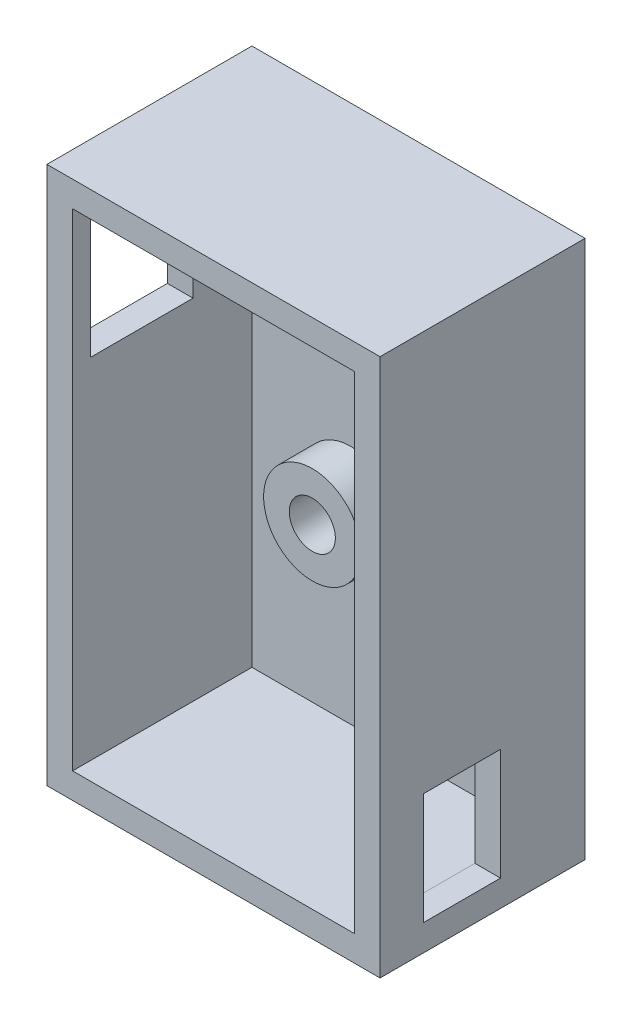
ISO-10303-21;
HEADER;
FILE_DESCRIPTION(('STEP AP214'),'2;1');
FILE_NAME('part.step','',(''),(''),'','','');
FILE_SCHEMA(('AUTOMOTIVE_DESIGN { 1 0 10303 214 1 1 1 1 }'));
ENDSEC;
DATA;
#1=APPLICATION_CONTEXT('core data for automotive mechanical design processes');
#2=APPLICATION_PROTOCOL_DEFINITION('international standard','automotive_design',2000,#1);
#3=PRODUCT_CONTEXT('',#1,'mechanical');
#4=PRODUCT('Part','Part','',(#3));
#5=PRODUCT_RELATED_PRODUCT_CATEGORY('part','',(#4));
#6=PRODUCT_DEFINITION_FORMATION('','',#4);
#7=PRODUCT_DEFINITION_CONTEXT('part definition',#1,'design');
#8=PRODUCT_DEFINITION('design','',#6,#7);
#9=PRODUCT_DEFINITION_SHAPE('','',#8);
#10=(LENGTH_UNIT() NAMED_UNIT(*) SI_UNIT(.MILLI.,.METRE.));
#11=(NAMED_UNIT(*) PLANE_ANGLE_UNIT() SI_UNIT($,.RADIAN.));
#12=(NAMED_UNIT(*) SI_UNIT($,.STERADIAN.) SOLID_ANGLE_UNIT());
#13=UNCERTAINTY_MEASURE_WITH_UNIT(LENGTH_MEASURE(1.E-05),#10,'distance_accuracy_value','');
#14=(GEOMETRIC_REPRESENTATION_CONTEXT(3) GLOBAL_UNCERTAINTY_ASSIGNED_CONTEXT((#13)) GLOBAL_UNIT_ASSIGNED_CONTEXT((#10,
#11,#12)) REPRESENTATION_CONTEXT('',''));
#15=CARTESIAN_POINT('',(0.,0.,0.));
#16=DIRECTION('',(0.,0.,1.));
#17=DIRECTION('',(1.,0.,0.));
#18=AXIS2_PLACEMENT_3D('',#15,#16,#17);
#19=CARTESIAN_POINT('',(-13.,-21.,16.));
#20=DIRECTION('',(1.,0.,0.));
#21=DIRECTION('',(0.,0.,-1.));
#22=AXIS2_PLACEMENT_3D('',#19,#20,#21);
#23=PLANE('',#22);
#24=DIRECTION('',(0.,-1.,0.));
#25=VECTOR('',#24,1.);
#26=CARTESIAN_POINT('',(-13.,18.9788433783349,6.6));
#27=LINE('',#26,#25);
#28=CARTESIAN_POINT('',(-13.,18.9788433783349,6.6));
#29=VERTEX_POINT('',#28);
#30=CARTESIAN_POINT('',(-13.,8.25334823970601,6.6));
#31=VERTEX_POINT('',#30);
#32=EDGE_CURVE('E207',#29,#31,#27,.T.);
#33=ORIENTED_EDGE('',*,*,#32,.F.);
#34=DIRECTION('',(0.,0.,-1.));
#35=VECTOR('',#34,1.);
#36=CARTESIAN_POINT('',(-13.,18.9788433783349,14.6));
#37=LINE('',#36,#35);
#38=CARTESIAN_POINT('',(-13.,18.9788433783349,14.6));
#39=VERTEX_POINT('',#38);
#40=EDGE_CURVE('E211',#39,#29,#37,.T.);
#41=ORIENTED_EDGE('',*,*,#40,.F.);
#42=DIRECTION('',(0.,1.,0.));
#43=VECTOR('',#42,1.);
#44=CARTESIAN_POINT('',(-13.,18.9788433783349,14.6));
#45=LINE('',#44,#43);
#46=CARTESIAN_POINT('',(-13.,8.25334823970601,14.6));
#47=VERTEX_POINT('',#46);
#48=EDGE_CURVE('E202',#47,#39,#45,.T.);
#49=ORIENTED_EDGE('',*,*,#48,.F.);
#50=DIRECTION('',(0.,0.,1.));
#51=VECTOR('',#50,1.);
#52=CARTESIAN_POINT('',(-13.,8.253348239706,14.6));
#53=LINE('',#52,#51);
#54=EDGE_CURVE('E203',#31,#47,#53,.T.);
#55=ORIENTED_EDGE('',*,*,#54,.F.);
#56=EDGE_LOOP('',(#33,#41,#49,#55));
#57=FACE_BOUND('',#56,.T.);
#58=DIRECTION('',(0.,-1.,0.));
#59=VECTOR('',#58,1.);
#60=CARTESIAN_POINT('',(-13.,-21.,0.));
#61=LINE('',#60,#59);
#62=CARTESIAN_POINT('',(-13.,21.,0.));
#63=VERTEX_POINT('',#62);
#64=CARTESIAN_POINT('',(-13.,-21.,0.));
#65=VERTEX_POINT('',#64);
#66=EDGE_CURVE('E287',#63,#65,#61,.T.);
#67=ORIENTED_EDGE('',*,*,#66,.T.);
#68=DIRECTION('',(0.,0.,-1.));
#69=VECTOR('',#68,1.);
#70=CARTESIAN_POINT('',(-13.,-21.,16.));
#71=LINE('',#70,#69);
#72=CARTESIAN_POINT('',(-13.,-21.,16.));
#73=VERTEX_POINT('',#72);
#74=EDGE_CURVE('E11',#73,#65,#71,.T.);
#75=ORIENTED_EDGE('',*,*,#74,.F.);
#76=DIRECTION('',(0.,-1.,0.));
#77=VECTOR('',#76,1.);
#78=CARTESIAN_POINT('',(-13.,-21.,16.));
#79=LINE('',#78,#77);
#80=CARTESIAN_POINT('',(-13.,21.,16.));
#81=VERTEX_POINT('',#80);
#82=EDGE_CURVE('E321',#81,#73,#79,.T.);
#83=ORIENTED_EDGE('',*,*,#82,.F.);
#84=DIRECTION('',(0.,0.,-1.));
#85=VECTOR('',#84,1.);
#86=CARTESIAN_POINT('',(-13.,21.,16.));
#87=LINE('',#86,#85);
#88=EDGE_CURVE('E335',#81,#63,#87,.T.);
#89=ORIENTED_EDGE('',*,*,#88,.T.);
#90=EDGE_LOOP('',(#67,#75,#83,#89));
#91=FACE_BOUND('',#90,.T.);
#92=ADVANCED_FACE('F43',(#57,#91),#23,.F.);
#93=CARTESIAN_POINT('',(13.,-21.,16.));
#94=DIRECTION('',(0.,1.,0.));
#95=DIRECTION('',(0.,0.,1.));
#96=AXIS2_PLACEMENT_3D('',#93,#94,#95);
#97=PLANE('',#96);
#98=DIRECTION('',(1.,0.,0.));
#99=VECTOR('',#98,1.);
#100=CARTESIAN_POINT('',(13.,-21.,0.));
#101=LINE('',#100,#99);
#102=CARTESIAN_POINT('',(13.,-21.,0.));
#103=VERTEX_POINT('',#102);
#104=EDGE_CURVE('E339',#65,#103,#101,.T.);
#105=ORIENTED_EDGE('',*,*,#104,.T.);
#106=DIRECTION('',(0.,0.,-1.));
#107=VECTOR('',#106,1.);
#108=CARTESIAN_POINT('',(13.,-21.,16.));
#109=LINE('',#108,#107);
#110=CARTESIAN_POINT('',(13.,-21.,16.));
#111=VERTEX_POINT('',#110);
#112=EDGE_CURVE('E51',#111,#103,#109,.T.);
#113=ORIENTED_EDGE('',*,*,#112,.F.);
#114=DIRECTION('',(1.,0.,0.));
#115=VECTOR('',#114,1.);
#116=CARTESIAN_POINT('',(13.,-21.,16.));
#117=LINE('',#116,#115);
#118=EDGE_CURVE('E325',#73,#111,#117,.T.);
#119=ORIENTED_EDGE('',*,*,#118,.F.);
#120=ORIENTED_EDGE('',*,*,#74,.T.);
#121=EDGE_LOOP('',(#105,#113,#119,#120));
#122=FACE_BOUND('',#121,.T.);
#123=ADVANCED_FACE('F375',(#122),#97,.F.);
#124=CARTESIAN_POINT('',(13.,-21.,16.));
#125=DIRECTION('',(-1.,0.,0.));
#126=DIRECTION('',(0.,-1.,0.));
#127=AXIS2_PLACEMENT_3D('',#124,#125,#126);
#128=PLANE('',#127);
#129=DIRECTION('',(0.,1.,0.));
#130=VECTOR('',#129,1.);
#131=CARTESIAN_POINT('',(13.,-10.2396995631783,6.6));
#132=LINE('',#131,#130);
#133=CARTESIAN_POINT('',(13.,-18.9486797720377,6.6));
#134=VERTEX_POINT('',#133);
#135=CARTESIAN_POINT('',(13.,-10.2396995631783,6.6));
#136=VERTEX_POINT('',#135);
#137=EDGE_CURVE('E184',#134,#136,#132,.T.);
#138=ORIENTED_EDGE('',*,*,#137,.F.);
#139=DIRECTION('',(0.,0.,-1.));
#140=VECTOR('',#139,1.);
#141=CARTESIAN_POINT('',(13.,-18.9486797720377,12.6));
#142=LINE('',#141,#140);
#143=CARTESIAN_POINT('',(13.,-18.9486797720377,12.6));
#144=VERTEX_POINT('',#143);
#145=EDGE_CURVE('E174',#144,#134,#142,.T.);
#146=ORIENTED_EDGE('',*,*,#145,.F.);
#147=DIRECTION('',(0.,-1.,0.));
#148=VECTOR('',#147,1.);
#149=CARTESIAN_POINT('',(13.,-10.2396995631783,12.6));
#150=LINE('',#149,#148);
#151=CARTESIAN_POINT('',(13.,-10.2396995631783,12.6));
#152=VERTEX_POINT('',#151);
#153=EDGE_CURVE('E188',#152,#144,#150,.T.);
#154=ORIENTED_EDGE('',*,*,#153,.F.);
#155=DIRECTION('',(0.,0.,1.));
#156=VECTOR('',#155,1.);
#157=CARTESIAN_POINT('',(13.,-10.2396995631783,12.6));
#158=LINE('',#157,#156);
#159=EDGE_CURVE('E58',#136,#152,#158,.T.);
#160=ORIENTED_EDGE('',*,*,#159,.F.);
#161=EDGE_LOOP('',(#138,#146,#154,#160));
#162=FACE_BOUND('',#161,.T.);
#163=DIRECTION('',(0.,1.,0.));
#164=VECTOR('',#163,1.);
#165=CARTESIAN_POINT('',(13.,-21.,0.));
#166=LINE('',#165,#164);
#167=CARTESIAN_POINT('',(13.,21.,0.));
#168=VERTEX_POINT('',#167);
#169=EDGE_CURVE('E342',#103,#168,#166,.T.);
#170=ORIENTED_EDGE('',*,*,#169,.T.);
#171=DIRECTION('',(0.,0.,-1.));
#172=VECTOR('',#171,1.);
#173=CARTESIAN_POINT('',(13.,21.,16.));
#174=LINE('',#173,#172);
#175=CARTESIAN_POINT('',(13.,21.,16.));
#176=VERTEX_POINT('',#175);
#177=EDGE_CURVE('E350',#176,#168,#174,.T.);
#178=ORIENTED_EDGE('',*,*,#177,.F.);
#179=DIRECTION('',(0.,1.,0.));
#180=VECTOR('',#179,1.);
#181=CARTESIAN_POINT('',(13.,-21.,16.));
#182=LINE('',#181,#180);
#183=EDGE_CURVE('E329',#111,#176,#182,.T.);
#184=ORIENTED_EDGE('',*,*,#183,.F.);
#185=ORIENTED_EDGE('',*,*,#112,.T.);
#186=EDGE_LOOP('',(#170,#178,#184,#185));
#187=FACE_BOUND('',#186,.T.);
#188=ADVANCED_FACE('F359',(#162,#187),#128,.F.);
#189=CARTESIAN_POINT('',(13.,21.,16.));
#190=DIRECTION('',(0.,-1.,0.));
#191=DIRECTION('',(1.,0.,0.));
#192=AXIS2_PLACEMENT_3D('',#189,#190,#191);
#193=PLANE('',#192);
#194=DIRECTION('',(-1.,0.,0.));
#195=VECTOR('',#194,1.);
#196=CARTESIAN_POINT('',(13.,21.,0.));
#197=LINE('',#196,#195);
#198=EDGE_CURVE('E326',#168,#63,#197,.T.);
#199=ORIENTED_EDGE('',*,*,#198,.T.);
#200=ORIENTED_EDGE('',*,*,#88,.F.);
#201=DIRECTION('',(-1.,0.,0.));
#202=VECTOR('',#201,1.);
#203=CARTESIAN_POINT('',(13.,21.,16.));
#204=LINE('',#203,#202);
#205=EDGE_CURVE('E332',#176,#81,#204,.T.);
#206=ORIENTED_EDGE('',*,*,#205,.F.);
#207=ORIENTED_EDGE('',*,*,#177,.T.);
#208=EDGE_LOOP('',(#199,#200,#206,#207));
#209=FACE_BOUND('',#208,.T.);
#210=ADVANCED_FACE('F368',(#209),#193,.F.);
#211=CARTESIAN_POINT('',(0.,0.,16.));
#212=DIRECTION('',(0.,0.,1.));
#213=DIRECTION('',(1.,0.,0.));
#214=AXIS2_PLACEMENT_3D('',#211,#212,#213);
#215=PLANE('',#214);
#216=DIRECTION('',(0.,-1.,0.));
#217=VECTOR('',#216,1.);
#218=CARTESIAN_POINT('',(-11.,-21.,16.));
#219=LINE('',#218,#217);
#220=CARTESIAN_POINT('',(-11.,19.,16.));
#221=VERTEX_POINT('',#220);
#222=CARTESIAN_POINT('',(-11.,-19.,16.));
#223=VERTEX_POINT('',#222);
#224=EDGE_CURVE('E309',#221,#223,#219,.T.);
#225=ORIENTED_EDGE('',*,*,#224,.F.);
#226=DIRECTION('',(-1.,0.,0.));
#227=VECTOR('',#226,1.);
#228=CARTESIAN_POINT('',(13.,19.,16.));
#229=LINE('',#228,#227);
#230=CARTESIAN_POINT('',(11.,19.,16.));
#231=VERTEX_POINT('',#230);
#232=EDGE_CURVE('E294',#231,#221,#229,.T.);
#233=ORIENTED_EDGE('',*,*,#232,.F.);
#234=DIRECTION('',(0.,1.,0.));
#235=VECTOR('',#234,1.);
#236=CARTESIAN_POINT('',(11.,-21.,16.));
#237=LINE('',#236,#235);
#238=CARTESIAN_POINT('',(11.,-19.,16.));
#239=VERTEX_POINT('',#238);
#240=EDGE_CURVE('E315',#239,#231,#237,.T.);
#241=ORIENTED_EDGE('',*,*,#240,.F.);
#242=DIRECTION('',(1.,0.,0.));
#243=VECTOR('',#242,1.);
#244=CARTESIAN_POINT('',(13.,-19.,16.));
#245=LINE('',#244,#243);
#246=EDGE_CURVE('E312',#223,#239,#245,.T.);
#247=ORIENTED_EDGE('',*,*,#246,.F.);
#248=EDGE_LOOP('',(#225,#233,#241,#247));
#249=FACE_BOUND('',#248,.T.);
#250=ORIENTED_EDGE('',*,*,#82,.T.);
#251=ORIENTED_EDGE('',*,*,#118,.T.);
#252=ORIENTED_EDGE('',*,*,#183,.T.);
#253=ORIENTED_EDGE('',*,*,#205,.T.);
#254=EDGE_LOOP('',(#250,#251,#252,#253));
#255=FACE_BOUND('',#254,.T.);
#256=ADVANCED_FACE('F374',(#249,#255),#215,.T.);
#257=CARTESIAN_POINT('',(0.,0.,0.));
#258=DIRECTION('',(0.,0.,1.));
#259=DIRECTION('',(1.,0.,0.));
#260=AXIS2_PLACEMENT_3D('',#257,#258,#259);
#261=PLANE('',#260);
#262=CARTESIAN_POINT('',(6.486240627427,13.7353561134825,0.));
#263=DIRECTION('',(0.,0.,1.));
#264=DIRECTION('',(1.,0.,0.));
#265=AXIS2_PLACEMENT_3D('',#262,#263,#264);
#266=CIRCLE('',#265,1.8);
#267=CARTESIAN_POINT('',(8.286240627427,13.7353561134825,0.));
#268=VERTEX_POINT('',#267);
#269=EDGE_CURVE('E247',#268,#268,#266,.F.);
#270=ORIENTED_EDGE('',*,*,#269,.F.);
#271=EDGE_LOOP('',(#270));
#272=FACE_BOUND('',#271,.T.);
#273=CARTESIAN_POINT('',(-3.28816906454668,-4.00641873558866,0.));
#274=DIRECTION('',(0.,0.,1.));
#275=DIRECTION('',(1.,0.,0.));
#276=AXIS2_PLACEMENT_3D('',#273,#274,#275);
#277=CIRCLE('',#276,1.8);
#278=CARTESIAN_POINT('',(-1.48816906454668,-4.00641873558866,0.));
#279=VERTEX_POINT('',#278);
#280=EDGE_CURVE('E246',#279,#279,#277,.F.);
#281=ORIENTED_EDGE('',*,*,#280,.F.);
#282=EDGE_LOOP('',(#281));
#283=FACE_BOUND('',#282,.T.);
#284=ORIENTED_EDGE('',*,*,#66,.F.);
#285=ORIENTED_EDGE('',*,*,#198,.F.);
#286=ORIENTED_EDGE('',*,*,#169,.F.);
#287=ORIENTED_EDGE('',*,*,#104,.F.);
#288=EDGE_LOOP('',(#284,#285,#286,#287));
#289=FACE_BOUND('',#288,.T.);
#290=ADVANCED_FACE('F365',(#272,#283,#289),#261,.F.);
#291=CARTESIAN_POINT('',(-11.,-21.,16.));
#292=DIRECTION('',(1.,0.,0.));
#293=DIRECTION('',(0.,0.,-1.));
#294=AXIS2_PLACEMENT_3D('',#291,#292,#293);
#295=PLANE('',#294);
#296=DIRECTION('',(0.,0.,-1.));
#297=VECTOR('',#296,1.);
#298=CARTESIAN_POINT('',(-11.,18.9788433783349,14.6));
#299=LINE('',#298,#297);
#300=CARTESIAN_POINT('',(-11.,18.9788433783349,14.6));
#301=VERTEX_POINT('',#300);
#302=CARTESIAN_POINT('',(-11.,18.9788433783349,6.6));
#303=VERTEX_POINT('',#302);
#304=EDGE_CURVE('E206',#301,#303,#299,.T.);
#305=ORIENTED_EDGE('',*,*,#304,.T.);
#306=DIRECTION('',(0.,-1.,0.));
#307=VECTOR('',#306,1.);
#308=CARTESIAN_POINT('',(-11.,18.9788433783349,6.6));
#309=LINE('',#308,#307);
#310=CARTESIAN_POINT('',(-11.,8.25334823970601,6.6));
#311=VERTEX_POINT('',#310);
#312=EDGE_CURVE('E233',#303,#311,#309,.T.);
#313=ORIENTED_EDGE('',*,*,#312,.T.);
#314=DIRECTION('',(0.,0.,1.));
#315=VECTOR('',#314,1.);
#316=CARTESIAN_POINT('',(-11.,8.253348239706,14.6));
#317=LINE('',#316,#315);
#318=CARTESIAN_POINT('',(-11.,8.253348239706,14.6));
#319=VERTEX_POINT('',#318);
#320=EDGE_CURVE('E228',#311,#319,#317,.T.);
#321=ORIENTED_EDGE('',*,*,#320,.T.);
#322=DIRECTION('',(0.,1.,0.));
#323=VECTOR('',#322,1.);
#324=CARTESIAN_POINT('',(-11.,18.9788433783349,14.6));
#325=LINE('',#324,#323);
#326=EDGE_CURVE('E222',#319,#301,#325,.T.);
#327=ORIENTED_EDGE('',*,*,#326,.T.);
#328=EDGE_LOOP('',(#305,#313,#321,#327));
#329=FACE_BOUND('',#328,.T.);
#330=DIRECTION('',(0.,-1.,0.));
#331=VECTOR('',#330,1.);
#332=CARTESIAN_POINT('',(-11.,-21.,2.));
#333=LINE('',#332,#331);
#334=CARTESIAN_POINT('',(-11.,19.,2.));
#335=VERTEX_POINT('',#334);
#336=CARTESIAN_POINT('',(-11.,-19.,2.));
#337=VERTEX_POINT('',#336);
#338=EDGE_CURVE('E275',#335,#337,#333,.T.);
#339=ORIENTED_EDGE('',*,*,#338,.F.);
#340=DIRECTION('',(0.,0.,-1.));
#341=VECTOR('',#340,1.);
#342=CARTESIAN_POINT('',(-11.,19.,16.));
#343=LINE('',#342,#341);
#344=EDGE_CURVE('E289',#221,#335,#343,.T.);
#345=ORIENTED_EDGE('',*,*,#344,.F.);
#346=ORIENTED_EDGE('',*,*,#224,.T.);
#347=DIRECTION('',(0.,0.,-1.));
#348=VECTOR('',#347,1.);
#349=CARTESIAN_POINT('',(-11.,-19.,16.));
#350=LINE('',#349,#348);
#351=EDGE_CURVE('E283',#223,#337,#350,.T.);
#352=ORIENTED_EDGE('',*,*,#351,.T.);
#353=EDGE_LOOP('',(#339,#345,#346,#352));
#354=FACE_BOUND('',#353,.T.);
#355=ADVANCED_FACE('F389',(#329,#354),#295,.T.);
#356=CARTESIAN_POINT('',(13.,-19.,16.));
#357=DIRECTION('',(0.,1.,0.));
#358=DIRECTION('',(0.,0.,1.));
#359=AXIS2_PLACEMENT_3D('',#356,#357,#358);
#360=PLANE('',#359);
#361=DIRECTION('',(1.,0.,0.));
#362=VECTOR('',#361,1.);
#363=CARTESIAN_POINT('',(13.,-19.,2.));
#364=LINE('',#363,#362);
#365=CARTESIAN_POINT('',(11.,-19.,2.));
#366=VERTEX_POINT('',#365);
#367=EDGE_CURVE('E282',#337,#366,#364,.T.);
#368=ORIENTED_EDGE('',*,*,#367,.F.);
#369=ORIENTED_EDGE('',*,*,#351,.F.);
#370=ORIENTED_EDGE('',*,*,#246,.T.);
#371=DIRECTION('',(0.,0.,-1.));
#372=VECTOR('',#371,1.);
#373=CARTESIAN_POINT('',(11.,-19.,16.));
#374=LINE('',#373,#372);
#375=EDGE_CURVE('E288',#239,#366,#374,.T.);
#376=ORIENTED_EDGE('',*,*,#375,.T.);
#377=EDGE_LOOP('',(#368,#369,#370,#376));
#378=FACE_BOUND('',#377,.T.);
#379=ADVANCED_FACE('F405',(#378),#360,.T.);
#380=CARTESIAN_POINT('',(11.,-21.,16.));
#381=DIRECTION('',(-1.,0.,0.));
#382=DIRECTION('',(0.,-1.,0.));
#383=AXIS2_PLACEMENT_3D('',#380,#381,#382);
#384=PLANE('',#383);
#385=DIRECTION('',(0.,0.,-1.));
#386=VECTOR('',#385,1.);
#387=CARTESIAN_POINT('',(11.,-18.9486797720377,12.6));
#388=LINE('',#387,#386);
#389=CARTESIAN_POINT('',(11.,-18.9486797720377,12.6));
#390=VERTEX_POINT('',#389);
#391=CARTESIAN_POINT('',(11.,-18.9486797720377,6.6));
#392=VERTEX_POINT('',#391);
#393=EDGE_CURVE('E171',#390,#392,#388,.T.);
#394=ORIENTED_EDGE('',*,*,#393,.T.);
#395=DIRECTION('',(0.,1.,0.));
#396=VECTOR('',#395,1.);
#397=CARTESIAN_POINT('',(11.,-10.2396995631783,6.6));
#398=LINE('',#397,#396);
#399=CARTESIAN_POINT('',(11.,-10.2396995631783,6.6));
#400=VERTEX_POINT('',#399);
#401=EDGE_CURVE('E157',#392,#400,#398,.T.);
#402=ORIENTED_EDGE('',*,*,#401,.T.);
#403=DIRECTION('',(0.,0.,1.));
#404=VECTOR('',#403,1.);
#405=CARTESIAN_POINT('',(11.,-10.2396995631783,12.6));
#406=LINE('',#405,#404);
#407=CARTESIAN_POINT('',(11.,-10.2396995631783,12.6));
#408=VERTEX_POINT('',#407);
#409=EDGE_CURVE('E193',#400,#408,#406,.T.);
#410=ORIENTED_EDGE('',*,*,#409,.T.);
#411=DIRECTION('',(0.,-1.,0.));
#412=VECTOR('',#411,1.);
#413=CARTESIAN_POINT('',(11.,-10.2396995631783,12.6));
#414=LINE('',#413,#412);
#415=EDGE_CURVE('E180',#408,#390,#414,.T.);
#416=ORIENTED_EDGE('',*,*,#415,.T.);
#417=EDGE_LOOP('',(#394,#402,#410,#416));
#418=FACE_BOUND('',#417,.T.);
#419=DIRECTION('',(0.,1.,0.));
#420=VECTOR('',#419,1.);
#421=CARTESIAN_POINT('',(11.,-21.,2.));
#422=LINE('',#421,#420);
#423=CARTESIAN_POINT('',(11.,19.,2.));
#424=VERTEX_POINT('',#423);
#425=EDGE_CURVE('E297',#366,#424,#422,.T.);
#426=ORIENTED_EDGE('',*,*,#425,.F.);
#427=ORIENTED_EDGE('',*,*,#375,.F.);
#428=ORIENTED_EDGE('',*,*,#240,.T.);
#429=DIRECTION('',(0.,0.,-1.));
#430=VECTOR('',#429,1.);
#431=CARTESIAN_POINT('',(11.,19.,16.));
#432=LINE('',#431,#430);
#433=EDGE_CURVE('E293',#231,#424,#432,.T.);
#434=ORIENTED_EDGE('',*,*,#433,.T.);
#435=EDGE_LOOP('',(#426,#427,#428,#434));
#436=FACE_BOUND('',#435,.T.);
#437=ADVANCED_FACE('F178',(#418,#436),#384,.T.);
#438=CARTESIAN_POINT('',(13.,19.,16.));
#439=DIRECTION('',(0.,-1.,0.));
#440=DIRECTION('',(1.,0.,0.));
#441=AXIS2_PLACEMENT_3D('',#438,#439,#440);
#442=PLANE('',#441);
#443=DIRECTION('',(-1.,0.,0.));
#444=VECTOR('',#443,1.);
#445=CARTESIAN_POINT('',(13.,19.,2.));
#446=LINE('',#445,#444);
#447=EDGE_CURVE('E303',#424,#335,#446,.T.);
#448=ORIENTED_EDGE('',*,*,#447,.F.);
#449=ORIENTED_EDGE('',*,*,#433,.F.);
#450=ORIENTED_EDGE('',*,*,#232,.T.);
#451=ORIENTED_EDGE('',*,*,#344,.T.);
#452=EDGE_LOOP('',(#448,#449,#450,#451));
#453=FACE_BOUND('',#452,.T.);
#454=ADVANCED_FACE('F398',(#453),#442,.T.);
#455=CARTESIAN_POINT('',(0.,0.,2.));
#456=DIRECTION('',(0.,0.,1.));
#457=DIRECTION('',(1.,0.,0.));
#458=AXIS2_PLACEMENT_3D('',#455,#456,#457);
#459=PLANE('',#458);
#460=CARTESIAN_POINT('',(6.486240627427,13.7353561134825,2.));
#461=DIRECTION('',(0.,0.,1.));
#462=DIRECTION('',(1.,0.,0.));
#463=AXIS2_PLACEMENT_3D('',#460,#461,#462);
#464=CIRCLE('',#463,3.8);
#465=CARTESIAN_POINT('',(10.286240627427,13.7353561134825,2.));
#466=VERTEX_POINT('',#465);
#467=EDGE_CURVE('E255',#466,#466,#464,.T.);
#468=ORIENTED_EDGE('',*,*,#467,.F.);
#469=EDGE_LOOP('',(#468));
#470=FACE_BOUND('',#469,.T.);
#471=CARTESIAN_POINT('',(-3.28816906454668,-4.00641873558866,2.));
#472=DIRECTION('',(0.,0.,1.));
#473=DIRECTION('',(1.,0.,0.));
#474=AXIS2_PLACEMENT_3D('',#471,#472,#473);
#475=CIRCLE('',#474,3.8);
#476=CARTESIAN_POINT('',(0.511830935453319,-4.00641873558866,2.));
#477=VERTEX_POINT('',#476);
#478=EDGE_CURVE('E270',#477,#477,#475,.T.);
#479=ORIENTED_EDGE('',*,*,#478,.F.);
#480=EDGE_LOOP('',(#479));
#481=FACE_BOUND('',#480,.T.);
#482=ORIENTED_EDGE('',*,*,#338,.T.);
#483=ORIENTED_EDGE('',*,*,#367,.T.);
#484=ORIENTED_EDGE('',*,*,#425,.T.);
#485=ORIENTED_EDGE('',*,*,#447,.T.);
#486=EDGE_LOOP('',(#482,#483,#484,#485));
#487=FACE_BOUND('',#486,.T.);
#488=ADVANCED_FACE('F394',(#470,#481,#487),#459,.T.);
#489=CARTESIAN_POINT('',(-3.28816906454668,-4.00641873558866,5.));
#490=DIRECTION('',(0.,0.,1.));
#491=DIRECTION('',(1.,0.,0.));
#492=AXIS2_PLACEMENT_3D('',#489,#490,#491);
#493=PLANE('',#492);
#494=CARTESIAN_POINT('',(-3.28816906454668,-4.00641873558866,5.));
#495=DIRECTION('',(0.,0.,1.));
#496=DIRECTION('',(1.,0.,0.));
#497=AXIS2_PLACEMENT_3D('',#494,#495,#496);
#498=CIRCLE('',#497,3.8);
#499=CARTESIAN_POINT('',(0.511830935453319,-4.00641873558866,5.));
#500=VERTEX_POINT('',#499);
#501=EDGE_CURVE('E271',#500,#500,#498,.T.);
#502=ORIENTED_EDGE('',*,*,#501,.T.);
#503=EDGE_LOOP('',(#502));
#504=FACE_BOUND('',#503,.T.);
#505=CARTESIAN_POINT('',(-3.28816906454668,-4.00641873558866,5.));
#506=DIRECTION('',(0.,0.,1.));
#507=DIRECTION('',(1.,0.,0.));
#508=AXIS2_PLACEMENT_3D('',#505,#506,#507);
#509=CIRCLE('',#508,1.8);
#510=CARTESIAN_POINT('',(-1.48816906454668,-4.00641873558866,5.));
#511=VERTEX_POINT('',#510);
#512=EDGE_CURVE('E266',#511,#511,#509,.T.);
#513=ORIENTED_EDGE('',*,*,#512,.F.);
#514=EDGE_LOOP('',(#513));
#515=FACE_BOUND('',#514,.T.);
#516=ADVANCED_FACE('F397',(#504,#515),#493,.T.);
#517=CARTESIAN_POINT('',(-3.28816906454668,-4.00641873558866,5.));
#518=DIRECTION('',(0.,0.,-1.));
#519=DIRECTION('',(-1.,0.,0.));
#520=AXIS2_PLACEMENT_3D('',#517,#518,#519);
#521=CYLINDRICAL_SURFACE('',#520,3.8);
#522=ORIENTED_EDGE('',*,*,#501,.F.);
#523=EDGE_LOOP('',(#522));
#524=FACE_BOUND('',#523,.T.);
#525=ORIENTED_EDGE('',*,*,#478,.T.);
#526=EDGE_LOOP('',(#525));
#527=FACE_BOUND('',#526,.T.);
#528=ADVANCED_FACE('F412',(#524,#527),#521,.T.);
#529=CARTESIAN_POINT('',(-3.28816906454668,-4.00641873558866,5.));
#530=DIRECTION('',(0.,0.,-1.));
#531=DIRECTION('',(-1.,0.,0.));
#532=AXIS2_PLACEMENT_3D('',#529,#530,#531);
#533=CYLINDRICAL_SURFACE('',#532,1.8);
#534=ORIENTED_EDGE('',*,*,#512,.T.);
#535=EDGE_LOOP('',(#534));
#536=FACE_BOUND('',#535,.T.);
#537=ORIENTED_EDGE('',*,*,#280,.T.);
#538=EDGE_LOOP('',(#537));
#539=FACE_BOUND('',#538,.T.);
#540=ADVANCED_FACE('F415',(#536,#539),#533,.F.);
#541=CARTESIAN_POINT('',(6.486240627427,13.7353561134825,5.));
#542=DIRECTION('',(0.,0.,1.));
#543=DIRECTION('',(1.,0.,0.));
#544=AXIS2_PLACEMENT_3D('',#541,#542,#543);
#545=PLANE('',#544);
#546=CARTESIAN_POINT('',(6.486240627427,13.7353561134825,5.));
#547=DIRECTION('',(0.,0.,1.));
#548=DIRECTION('',(1.,0.,0.));
#549=AXIS2_PLACEMENT_3D('',#546,#547,#548);
#550=CIRCLE('',#549,3.8);
#551=CARTESIAN_POINT('',(10.286240627427,13.7353561134825,5.));
#552=VERTEX_POINT('',#551);
#553=EDGE_CURVE('E251',#552,#552,#550,.T.);
#554=ORIENTED_EDGE('',*,*,#553,.T.);
#555=EDGE_LOOP('',(#554));
#556=FACE_BOUND('',#555,.T.);
#557=CARTESIAN_POINT('',(6.486240627427,13.7353561134825,5.));
#558=DIRECTION('',(0.,0.,1.));
#559=DIRECTION('',(1.,0.,0.));
#560=AXIS2_PLACEMENT_3D('',#557,#558,#559);
#561=CIRCLE('',#560,1.8);
#562=CARTESIAN_POINT('',(8.286240627427,13.7353561134825,5.));
#563=VERTEX_POINT('',#562);
#564=EDGE_CURVE('E259',#563,#563,#561,.T.);
#565=ORIENTED_EDGE('',*,*,#564,.F.);
#566=EDGE_LOOP('',(#565));
#567=FACE_BOUND('',#566,.T.);
#568=ADVANCED_FACE('F422',(#556,#567),#545,.T.);
#569=CARTESIAN_POINT('',(6.486240627427,13.7353561134825,5.));
#570=DIRECTION('',(0.,0.,-1.));
#571=DIRECTION('',(-1.,0.,0.));
#572=AXIS2_PLACEMENT_3D('',#569,#570,#571);
#573=CYLINDRICAL_SURFACE('',#572,3.8);
#574=ORIENTED_EDGE('',*,*,#553,.F.);
#575=EDGE_LOOP('',(#574));
#576=FACE_BOUND('',#575,.T.);
#577=ORIENTED_EDGE('',*,*,#467,.T.);
#578=EDGE_LOOP('',(#577));
#579=FACE_BOUND('',#578,.T.);
#580=ADVANCED_FACE('F428',(#576,#579),#573,.T.);
#581=CARTESIAN_POINT('',(6.486240627427,13.7353561134825,5.));
#582=DIRECTION('',(0.,0.,-1.));
#583=DIRECTION('',(-1.,0.,0.));
#584=AXIS2_PLACEMENT_3D('',#581,#582,#583);
#585=CYLINDRICAL_SURFACE('',#584,1.8);
#586=ORIENTED_EDGE('',*,*,#564,.T.);
#587=EDGE_LOOP('',(#586));
#588=FACE_BOUND('',#587,.T.);
#589=ORIENTED_EDGE('',*,*,#269,.T.);
#590=EDGE_LOOP('',(#589));
#591=FACE_BOUND('',#590,.T.);
#592=ADVANCED_FACE('F424',(#588,#591),#585,.F.);
#593=CARTESIAN_POINT('',(2.3804426671449,18.9788433783349,14.6));
#594=DIRECTION('',(0.,1.,0.));
#595=DIRECTION('',(0.,0.,1.));
#596=AXIS2_PLACEMENT_3D('',#593,#594,#595);
#597=PLANE('',#596);
#598=DIRECTION('',(-1.,0.,0.));
#599=VECTOR('',#598,1.);
#600=CARTESIAN_POINT('',(2.3804426671449,18.9788433783349,14.6));
#601=LINE('',#600,#599);
#602=EDGE_CURVE('E226',#301,#39,#601,.T.);
#603=ORIENTED_EDGE('',*,*,#602,.T.);
#604=ORIENTED_EDGE('',*,*,#40,.T.);
#605=DIRECTION('',(-1.,0.,0.));
#606=VECTOR('',#605,1.);
#607=CARTESIAN_POINT('',(2.3804426671449,18.9788433783349,6.6));
#608=LINE('',#607,#606);
#609=EDGE_CURVE('E221',#303,#29,#608,.T.);
#610=ORIENTED_EDGE('',*,*,#609,.F.);
#611=ORIENTED_EDGE('',*,*,#304,.F.);
#612=EDGE_LOOP('',(#603,#604,#610,#611));
#613=FACE_BOUND('',#612,.T.);
#614=ADVANCED_FACE('F427',(#613),#597,.F.);
#615=CARTESIAN_POINT('',(2.3804426671449,18.9788433783349,6.6));
#616=DIRECTION('',(0.,0.,-1.));
#617=DIRECTION('',(0.,1.,0.));
#618=AXIS2_PLACEMENT_3D('',#615,#616,#617);
#619=PLANE('',#618);
#620=ORIENTED_EDGE('',*,*,#609,.T.);
#621=ORIENTED_EDGE('',*,*,#32,.T.);
#622=DIRECTION('',(-1.,0.,0.));
#623=VECTOR('',#622,1.);
#624=CARTESIAN_POINT('',(2.3804426671449,8.25334823970601,6.6));
#625=LINE('',#624,#623);
#626=EDGE_CURVE('E232',#311,#31,#625,.T.);
#627=ORIENTED_EDGE('',*,*,#626,.F.);
#628=ORIENTED_EDGE('',*,*,#312,.F.);
#629=EDGE_LOOP('',(#620,#621,#627,#628));
#630=FACE_BOUND('',#629,.T.);
#631=ADVANCED_FACE('F438',(#630),#619,.F.);
#632=CARTESIAN_POINT('',(2.3804426671449,8.253348239706,14.6));
#633=DIRECTION('',(0.,-1.,0.));
#634=DIRECTION('',(0.,0.,-1.));
#635=AXIS2_PLACEMENT_3D('',#632,#633,#634);
#636=PLANE('',#635);
#637=ORIENTED_EDGE('',*,*,#626,.T.);
#638=ORIENTED_EDGE('',*,*,#54,.T.);
#639=DIRECTION('',(-1.,0.,0.));
#640=VECTOR('',#639,1.);
#641=CARTESIAN_POINT('',(2.3804426671449,8.253348239706,14.6));
#642=LINE('',#641,#640);
#643=EDGE_CURVE('E227',#319,#47,#642,.T.);
#644=ORIENTED_EDGE('',*,*,#643,.F.);
#645=ORIENTED_EDGE('',*,*,#320,.F.);
#646=EDGE_LOOP('',(#637,#638,#644,#645));
#647=FACE_BOUND('',#646,.T.);
#648=ADVANCED_FACE('F442',(#647),#636,.F.);
#649=CARTESIAN_POINT('',(2.3804426671449,18.9788433783349,14.6));
#650=DIRECTION('',(0.,0.,1.));
#651=DIRECTION('',(1.,0.,0.));
#652=AXIS2_PLACEMENT_3D('',#649,#650,#651);
#653=PLANE('',#652);
#654=ORIENTED_EDGE('',*,*,#643,.T.);
#655=ORIENTED_EDGE('',*,*,#48,.T.);
#656=ORIENTED_EDGE('',*,*,#602,.F.);
#657=ORIENTED_EDGE('',*,*,#326,.F.);
#658=EDGE_LOOP('',(#654,#655,#656,#657));
#659=FACE_BOUND('',#658,.T.);
#660=ADVANCED_FACE('F446',(#659),#653,.F.);
#661=CARTESIAN_POINT('',(0.424257176051143,-18.9486797720377,12.6));
#662=DIRECTION('',(0.,-1.,0.));
#663=DIRECTION('',(0.,0.,-1.));
#664=AXIS2_PLACEMENT_3D('',#661,#662,#663);
#665=PLANE('',#664);
#666=DIRECTION('',(1.,0.,0.));
#667=VECTOR('',#666,1.);
#668=CARTESIAN_POINT('',(0.424257176051143,-18.9486797720377,12.6));
#669=LINE('',#668,#667);
#670=EDGE_CURVE('E66',#390,#144,#669,.T.);
#671=ORIENTED_EDGE('',*,*,#670,.T.);
#672=ORIENTED_EDGE('',*,*,#145,.T.);
#673=DIRECTION('',(1.,0.,0.));
#674=VECTOR('',#673,1.);
#675=CARTESIAN_POINT('',(0.424257176051143,-18.9486797720377,6.6));
#676=LINE('',#675,#674);
#677=EDGE_CURVE('E161',#392,#134,#676,.T.);
#678=ORIENTED_EDGE('',*,*,#677,.F.);
#679=ORIENTED_EDGE('',*,*,#393,.F.);
#680=EDGE_LOOP('',(#671,#672,#678,#679));
#681=FACE_BOUND('',#680,.T.);
#682=ADVANCED_FACE('F170',(#681),#665,.F.);
#683=CARTESIAN_POINT('',(0.424257176051143,-10.2396995631783,6.6));
#684=DIRECTION('',(0.,0.,-1.));
#685=DIRECTION('',(0.,1.,0.));
#686=AXIS2_PLACEMENT_3D('',#683,#684,#685);
#687=PLANE('',#686);
#688=ORIENTED_EDGE('',*,*,#677,.T.);
#689=ORIENTED_EDGE('',*,*,#137,.T.);
#690=DIRECTION('',(1.,0.,0.));
#691=VECTOR('',#690,1.);
#692=CARTESIAN_POINT('',(0.424257176051143,-10.2396995631783,6.6));
#693=LINE('',#692,#691);
#694=EDGE_CURVE('E163',#400,#136,#693,.T.);
#695=ORIENTED_EDGE('',*,*,#694,.F.);
#696=ORIENTED_EDGE('',*,*,#401,.F.);
#697=EDGE_LOOP('',(#688,#689,#695,#696));
#698=FACE_BOUND('',#697,.T.);
#699=ADVANCED_FACE('F159',(#698),#687,.F.);
#700=CARTESIAN_POINT('',(0.424257176051143,-10.2396995631783,12.6));
#701=DIRECTION('',(0.,1.,0.));
#702=DIRECTION('',(0.,0.,1.));
#703=AXIS2_PLACEMENT_3D('',#700,#701,#702);
#704=PLANE('',#703);
#705=ORIENTED_EDGE('',*,*,#694,.T.);
#706=ORIENTED_EDGE('',*,*,#159,.T.);
#707=DIRECTION('',(1.,0.,0.));
#708=VECTOR('',#707,1.);
#709=CARTESIAN_POINT('',(0.424257176051143,-10.2396995631783,12.6));
#710=LINE('',#709,#708);
#711=EDGE_CURVE('E192',#408,#152,#710,.T.);
#712=ORIENTED_EDGE('',*,*,#711,.F.);
#713=ORIENTED_EDGE('',*,*,#409,.F.);
#714=EDGE_LOOP('',(#705,#706,#712,#713));
#715=FACE_BOUND('',#714,.T.);
#716=ADVANCED_FACE('F455',(#715),#704,.F.);
#717=CARTESIAN_POINT('',(0.424257176051143,-10.2396995631783,12.6));
#718=DIRECTION('',(0.,0.,1.));
#719=DIRECTION('',(1.,0.,0.));
#720=AXIS2_PLACEMENT_3D('',#717,#718,#719);
#721=PLANE('',#720);
#722=ORIENTED_EDGE('',*,*,#711,.T.);
#723=ORIENTED_EDGE('',*,*,#153,.T.);
#724=ORIENTED_EDGE('',*,*,#670,.F.);
#725=ORIENTED_EDGE('',*,*,#415,.F.);
#726=EDGE_LOOP('',(#722,#723,#724,#725));
#727=FACE_BOUND('',#726,.T.);
#728=ADVANCED_FACE('F458',(#727),#721,.F.);
#729=CLOSED_SHELL('',(#92,#123,#188,#210,#256,#290,#355,#379,#437,#454,#488,#516,#528,#540,#568,
#580,#592,#614,#631,#648,#660,#682,#699,#716,#728));
#730=MANIFOLD_SOLID_BREP('B2',#729);
#731=ADVANCED_BREP_SHAPE_REPRESENTATION('',(#18,#730),#14);
#732=SHAPE_DEFINITION_REPRESENTATION(#9,#731);
ENDSEC;
END-ISO-10303-21;
